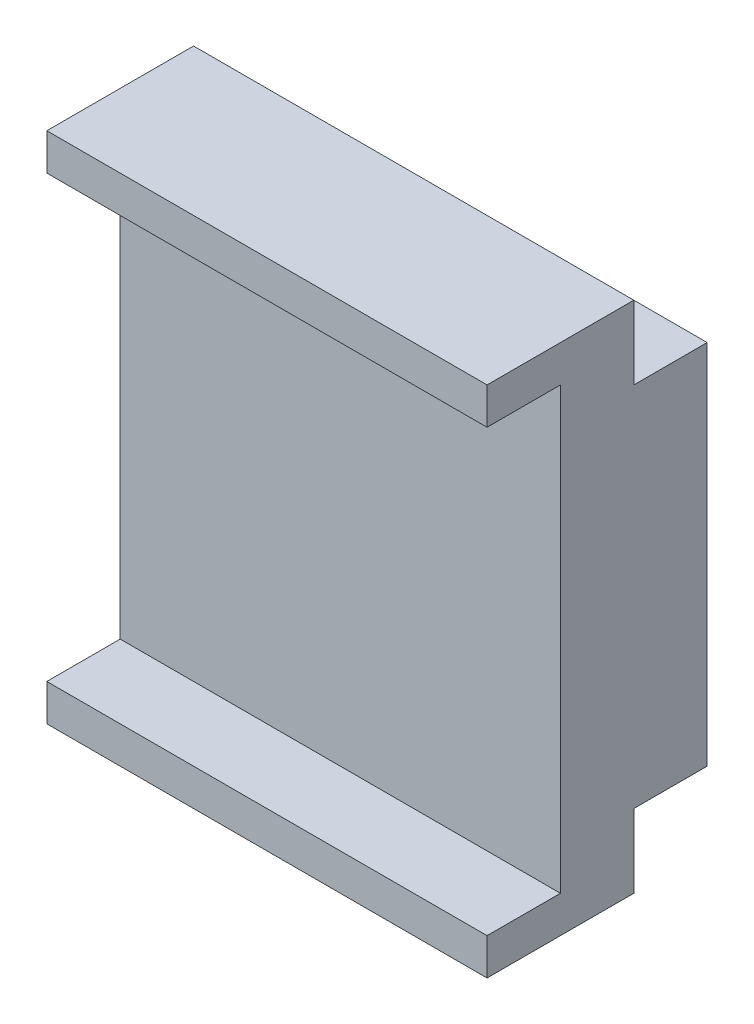
ISO-10303-21;
HEADER;
FILE_DESCRIPTION(('STEP AP214'),'2;1');
FILE_NAME('part.step','',(''),(''),'','','');
FILE_SCHEMA(('AUTOMOTIVE_DESIGN { 1 0 10303 214 1 1 1 1 }'));
ENDSEC;
DATA;
#1=APPLICATION_CONTEXT('core data for automotive mechanical design processes');
#2=APPLICATION_PROTOCOL_DEFINITION('international standard','automotive_design',2000,#1);
#3=PRODUCT_CONTEXT('',#1,'mechanical');
#4=PRODUCT('Part','Part','',(#3));
#5=PRODUCT_RELATED_PRODUCT_CATEGORY('part','',(#4));
#6=PRODUCT_DEFINITION_FORMATION('','',#4);
#7=PRODUCT_DEFINITION_CONTEXT('part definition',#1,'design');
#8=PRODUCT_DEFINITION('design','',#6,#7);
#9=PRODUCT_DEFINITION_SHAPE('','',#8);
#10=(LENGTH_UNIT() NAMED_UNIT(*) SI_UNIT(.MILLI.,.METRE.));
#11=(NAMED_UNIT(*) PLANE_ANGLE_UNIT() SI_UNIT($,.RADIAN.));
#12=(NAMED_UNIT(*) SI_UNIT($,.STERADIAN.) SOLID_ANGLE_UNIT());
#13=UNCERTAINTY_MEASURE_WITH_UNIT(LENGTH_MEASURE(1.E-05),#10,'distance_accuracy_value','');
#14=(GEOMETRIC_REPRESENTATION_CONTEXT(3) GLOBAL_UNCERTAINTY_ASSIGNED_CONTEXT((#13)) GLOBAL_UNIT_ASSIGNED_CONTEXT((#10,
#11,#12)) REPRESENTATION_CONTEXT('',''));
#15=CARTESIAN_POINT('',(0.,0.,0.));
#16=DIRECTION('',(0.,0.,1.));
#17=DIRECTION('',(1.,0.,0.));
#18=AXIS2_PLACEMENT_3D('',#15,#16,#17);
#19=CARTESIAN_POINT('',(30.,5.,0.));
#20=DIRECTION('',(0.,1.,0.));
#21=DIRECTION('',(0.,0.,1.));
#22=AXIS2_PLACEMENT_3D('',#19,#20,#21);
#23=PLANE('',#22);
#24=DIRECTION('',(0.,0.,-1.));
#25=VECTOR('',#24,1.);
#26=CARTESIAN_POINT('',(0.,5.,0.));
#27=LINE('',#26,#25);
#28=CARTESIAN_POINT('',(0.,5.,-5.));
#29=VERTEX_POINT('',#28);
#30=CARTESIAN_POINT('',(0.,5.,-10.));
#31=VERTEX_POINT('',#30);
#32=EDGE_CURVE('E154',#29,#31,#27,.T.);
#33=ORIENTED_EDGE('',*,*,#32,.T.);
#34=DIRECTION('',(-1.,0.,0.));
#35=VECTOR('',#34,1.);
#36=CARTESIAN_POINT('',(30.,5.,-10.));
#37=LINE('',#36,#35);
#38=CARTESIAN_POINT('',(30.,5.,-10.));
#39=VERTEX_POINT('',#38);
#40=EDGE_CURVE('E11',#39,#31,#37,.T.);
#41=ORIENTED_EDGE('',*,*,#40,.F.);
#42=DIRECTION('',(0.,0.,-1.));
#43=VECTOR('',#42,1.);
#44=CARTESIAN_POINT('',(30.,5.,0.));
#45=LINE('',#44,#43);
#46=CARTESIAN_POINT('',(30.,5.,-5.));
#47=VERTEX_POINT('',#46);
#48=EDGE_CURVE('E222',#47,#39,#45,.T.);
#49=ORIENTED_EDGE('',*,*,#48,.F.);
#50=DIRECTION('',(-1.,0.,0.));
#51=VECTOR('',#50,1.);
#52=CARTESIAN_POINT('',(30.,5.,-5.));
#53=LINE('',#52,#51);
#54=EDGE_CURVE('E183',#47,#29,#53,.T.);
#55=ORIENTED_EDGE('',*,*,#54,.T.);
#56=EDGE_LOOP('',(#33,#41,#49,#55));
#57=FACE_BOUND('',#56,.T.);
#58=ADVANCED_FACE('F34',(#57),#23,.F.);
#59=CARTESIAN_POINT('',(30.,0.,-10.));
#60=DIRECTION('',(0.,0.,1.));
#61=DIRECTION('',(1.,0.,0.));
#62=AXIS2_PLACEMENT_3D('',#59,#60,#61);
#63=PLANE('',#62);
#64=DIRECTION('',(0.,1.,0.));
#65=VECTOR('',#64,1.);
#66=CARTESIAN_POINT('',(0.,0.,-10.));
#67=LINE('',#66,#65);
#68=CARTESIAN_POINT('',(0.,30.,-10.));
#69=VERTEX_POINT('',#68);
#70=EDGE_CURVE('E157',#31,#69,#67,.T.);
#71=ORIENTED_EDGE('',*,*,#70,.T.);
#72=DIRECTION('',(-1.,0.,0.));
#73=VECTOR('',#72,1.);
#74=CARTESIAN_POINT('',(30.,30.,-10.));
#75=LINE('',#74,#73);
#76=CARTESIAN_POINT('',(30.,30.,-10.));
#77=VERTEX_POINT('',#76);
#78=EDGE_CURVE('E42',#77,#69,#75,.T.);
#79=ORIENTED_EDGE('',*,*,#78,.F.);
#80=DIRECTION('',(0.,1.,0.));
#81=VECTOR('',#80,1.);
#82=CARTESIAN_POINT('',(30.,0.,-10.));
#83=LINE('',#82,#81);
#84=EDGE_CURVE('E104',#39,#77,#83,.T.);
#85=ORIENTED_EDGE('',*,*,#84,.F.);
#86=ORIENTED_EDGE('',*,*,#40,.T.);
#87=EDGE_LOOP('',(#71,#79,#85,#86));
#88=FACE_BOUND('',#87,.T.);
#89=ADVANCED_FACE('F204',(#88),#63,.F.);
#90=CARTESIAN_POINT('',(30.,30.,0.));
#91=DIRECTION('',(0.,1.,0.));
#92=DIRECTION('',(0.,0.,1.));
#93=AXIS2_PLACEMENT_3D('',#90,#91,#92);
#94=PLANE('',#93);
#95=DIRECTION('',(0.,0.,-1.));
#96=VECTOR('',#95,1.);
#97=CARTESIAN_POINT('',(0.,30.,0.));
#98=LINE('',#97,#96);
#99=CARTESIAN_POINT('',(0.,30.,-5.));
#100=VERTEX_POINT('',#99);
#101=EDGE_CURVE('E160',#100,#69,#98,.T.);
#102=ORIENTED_EDGE('',*,*,#101,.F.);
#103=DIRECTION('',(-1.,0.,0.));
#104=VECTOR('',#103,1.);
#105=CARTESIAN_POINT('',(30.,30.,-5.));
#106=LINE('',#105,#104);
#107=CARTESIAN_POINT('',(30.,30.,-5.));
#108=VERTEX_POINT('',#107);
#109=EDGE_CURVE('E197',#108,#100,#106,.T.);
#110=ORIENTED_EDGE('',*,*,#109,.F.);
#111=DIRECTION('',(0.,0.,-1.));
#112=VECTOR('',#111,1.);
#113=CARTESIAN_POINT('',(30.,30.,0.));
#114=LINE('',#113,#112);
#115=EDGE_CURVE('E203',#108,#77,#114,.T.);
#116=ORIENTED_EDGE('',*,*,#115,.T.);
#117=ORIENTED_EDGE('',*,*,#78,.T.);
#118=EDGE_LOOP('',(#102,#110,#116,#117));
#119=FACE_BOUND('',#118,.T.);
#120=ADVANCED_FACE('F201',(#119),#94,.T.);
#121=CARTESIAN_POINT('',(30.,0.,-5.));
#122=DIRECTION('',(0.,0.,1.));
#123=DIRECTION('',(1.,0.,0.));
#124=AXIS2_PLACEMENT_3D('',#121,#122,#123);
#125=PLANE('',#124);
#126=DIRECTION('',(0.,1.,0.));
#127=VECTOR('',#126,1.);
#128=CARTESIAN_POINT('',(0.,0.,-5.));
#129=LINE('',#128,#127);
#130=CARTESIAN_POINT('',(0.,35.,-5.));
#131=VERTEX_POINT('',#130);
#132=EDGE_CURVE('E163',#100,#131,#129,.T.);
#133=ORIENTED_EDGE('',*,*,#132,.T.);
#134=DIRECTION('',(-1.,0.,0.));
#135=VECTOR('',#134,1.);
#136=CARTESIAN_POINT('',(30.,35.,-5.));
#137=LINE('',#136,#135);
#138=CARTESIAN_POINT('',(30.,35.,-5.));
#139=VERTEX_POINT('',#138);
#140=EDGE_CURVE('E195',#139,#131,#137,.T.);
#141=ORIENTED_EDGE('',*,*,#140,.F.);
#142=DIRECTION('',(0.,1.,0.));
#143=VECTOR('',#142,1.);
#144=CARTESIAN_POINT('',(30.,0.,-5.));
#145=LINE('',#144,#143);
#146=EDGE_CURVE('E217',#108,#139,#145,.T.);
#147=ORIENTED_EDGE('',*,*,#146,.F.);
#148=ORIENTED_EDGE('',*,*,#109,.T.);
#149=EDGE_LOOP('',(#133,#141,#147,#148));
#150=FACE_BOUND('',#149,.T.);
#151=ADVANCED_FACE('F214',(#150),#125,.F.);
#152=CARTESIAN_POINT('',(30.,35.,0.));
#153=DIRECTION('',(0.,1.,0.));
#154=DIRECTION('',(0.,0.,1.));
#155=AXIS2_PLACEMENT_3D('',#152,#153,#154);
#156=PLANE('',#155);
#157=DIRECTION('',(0.,0.,-1.));
#158=VECTOR('',#157,1.);
#159=CARTESIAN_POINT('',(0.,35.,0.));
#160=LINE('',#159,#158);
#161=CARTESIAN_POINT('',(0.,35.,5.));
#162=VERTEX_POINT('',#161);
#163=EDGE_CURVE('E166',#162,#131,#160,.T.);
#164=ORIENTED_EDGE('',*,*,#163,.F.);
#165=DIRECTION('',(-1.,0.,0.));
#166=VECTOR('',#165,1.);
#167=CARTESIAN_POINT('',(30.,35.,5.));
#168=LINE('',#167,#166);
#169=CARTESIAN_POINT('',(30.,35.,5.));
#170=VERTEX_POINT('',#169);
#171=EDGE_CURVE('E193',#170,#162,#168,.T.);
#172=ORIENTED_EDGE('',*,*,#171,.F.);
#173=DIRECTION('',(0.,0.,-1.));
#174=VECTOR('',#173,1.);
#175=CARTESIAN_POINT('',(30.,35.,0.));
#176=LINE('',#175,#174);
#177=EDGE_CURVE('E219',#170,#139,#176,.T.);
#178=ORIENTED_EDGE('',*,*,#177,.T.);
#179=ORIENTED_EDGE('',*,*,#140,.T.);
#180=EDGE_LOOP('',(#164,#172,#178,#179));
#181=FACE_BOUND('',#180,.T.);
#182=ADVANCED_FACE('F269',(#181),#156,.T.);
#183=CARTESIAN_POINT('',(30.,0.,5.00000000000001));
#184=DIRECTION('',(0.,0.,-1.));
#185=DIRECTION('',(0.,1.,0.));
#186=AXIS2_PLACEMENT_3D('',#183,#184,#185);
#187=PLANE('',#186);
#188=DIRECTION('',(0.,-1.,0.));
#189=VECTOR('',#188,1.);
#190=CARTESIAN_POINT('',(0.,0.,5.00000000000001));
#191=LINE('',#190,#189);
#192=CARTESIAN_POINT('',(0.,32.5,5.));
#193=VERTEX_POINT('',#192);
#194=EDGE_CURVE('E169',#162,#193,#191,.T.);
#195=ORIENTED_EDGE('',*,*,#194,.T.);
#196=DIRECTION('',(-1.,0.,0.));
#197=VECTOR('',#196,1.);
#198=CARTESIAN_POINT('',(30.,32.5,5.));
#199=LINE('',#198,#197);
#200=CARTESIAN_POINT('',(30.,32.5,5.));
#201=VERTEX_POINT('',#200);
#202=EDGE_CURVE('E191',#201,#193,#199,.T.);
#203=ORIENTED_EDGE('',*,*,#202,.F.);
#204=DIRECTION('',(0.,-1.,0.));
#205=VECTOR('',#204,1.);
#206=CARTESIAN_POINT('',(30.,0.,5.00000000000001));
#207=LINE('',#206,#205);
#208=EDGE_CURVE('E227',#170,#201,#207,.T.);
#209=ORIENTED_EDGE('',*,*,#208,.F.);
#210=ORIENTED_EDGE('',*,*,#171,.T.);
#211=EDGE_LOOP('',(#195,#203,#209,#210));
#212=FACE_BOUND('',#211,.T.);
#213=ADVANCED_FACE('F274',(#212),#187,.F.);
#214=CARTESIAN_POINT('',(30.,32.5,0.));
#215=DIRECTION('',(0.,-1.,0.));
#216=DIRECTION('',(0.,0.,-1.));
#217=AXIS2_PLACEMENT_3D('',#214,#215,#216);
#218=PLANE('',#217);
#219=DIRECTION('',(0.,0.,1.));
#220=VECTOR('',#219,1.);
#221=CARTESIAN_POINT('',(0.,32.5,0.));
#222=LINE('',#221,#220);
#223=CARTESIAN_POINT('',(0.,32.5,0.));
#224=VERTEX_POINT('',#223);
#225=EDGE_CURVE('E172',#224,#193,#222,.T.);
#226=ORIENTED_EDGE('',*,*,#225,.F.);
#227=DIRECTION('',(-1.,0.,0.));
#228=VECTOR('',#227,1.);
#229=CARTESIAN_POINT('',(30.,32.5,0.));
#230=LINE('',#229,#228);
#231=CARTESIAN_POINT('',(30.,32.5,0.));
#232=VERTEX_POINT('',#231);
#233=EDGE_CURVE('E189',#232,#224,#230,.T.);
#234=ORIENTED_EDGE('',*,*,#233,.F.);
#235=DIRECTION('',(0.,0.,1.));
#236=VECTOR('',#235,1.);
#237=CARTESIAN_POINT('',(30.,32.5,0.));
#238=LINE('',#237,#236);
#239=EDGE_CURVE('E229',#232,#201,#238,.T.);
#240=ORIENTED_EDGE('',*,*,#239,.T.);
#241=ORIENTED_EDGE('',*,*,#202,.T.);
#242=EDGE_LOOP('',(#226,#234,#240,#241));
#243=FACE_BOUND('',#242,.T.);
#244=ADVANCED_FACE('F240',(#243),#218,.T.);
#245=CARTESIAN_POINT('',(30.,0.,0.));
#246=DIRECTION('',(0.,0.,1.));
#247=DIRECTION('',(1.,0.,0.));
#248=AXIS2_PLACEMENT_3D('',#245,#246,#247);
#249=PLANE('',#248);
#250=DIRECTION('',(0.,1.,0.));
#251=VECTOR('',#250,1.);
#252=CARTESIAN_POINT('',(0.,0.,0.));
#253=LINE('',#252,#251);
#254=CARTESIAN_POINT('',(0.,2.5,0.));
#255=VERTEX_POINT('',#254);
#256=EDGE_CURVE('E175',#255,#224,#253,.T.);
#257=ORIENTED_EDGE('',*,*,#256,.F.);
#258=DIRECTION('',(-1.,0.,0.));
#259=VECTOR('',#258,1.);
#260=CARTESIAN_POINT('',(30.,2.5,0.));
#261=LINE('',#260,#259);
#262=CARTESIAN_POINT('',(30.,2.5,0.));
#263=VERTEX_POINT('',#262);
#264=EDGE_CURVE('E187',#263,#255,#261,.T.);
#265=ORIENTED_EDGE('',*,*,#264,.F.);
#266=DIRECTION('',(0.,1.,0.));
#267=VECTOR('',#266,1.);
#268=CARTESIAN_POINT('',(30.,0.,0.));
#269=LINE('',#268,#267);
#270=EDGE_CURVE('E150',#263,#232,#269,.T.);
#271=ORIENTED_EDGE('',*,*,#270,.T.);
#272=ORIENTED_EDGE('',*,*,#233,.T.);
#273=EDGE_LOOP('',(#257,#265,#271,#272));
#274=FACE_BOUND('',#273,.T.);
#275=ADVANCED_FACE('F234',(#274),#249,.T.);
#276=CARTESIAN_POINT('',(30.,2.5,0.));
#277=DIRECTION('',(0.,-1.,0.));
#278=DIRECTION('',(0.,0.,-1.));
#279=AXIS2_PLACEMENT_3D('',#276,#277,#278);
#280=PLANE('',#279);
#281=DIRECTION('',(0.,0.,1.));
#282=VECTOR('',#281,1.);
#283=CARTESIAN_POINT('',(0.,2.5,0.));
#284=LINE('',#283,#282);
#285=CARTESIAN_POINT('',(0.,2.5,5.));
#286=VERTEX_POINT('',#285);
#287=EDGE_CURVE('E178',#255,#286,#284,.T.);
#288=ORIENTED_EDGE('',*,*,#287,.T.);
#289=DIRECTION('',(-1.,0.,0.));
#290=VECTOR('',#289,1.);
#291=CARTESIAN_POINT('',(30.,2.5,5.));
#292=LINE('',#291,#290);
#293=CARTESIAN_POINT('',(30.,2.5,5.));
#294=VERTEX_POINT('',#293);
#295=EDGE_CURVE('E138',#294,#286,#292,.T.);
#296=ORIENTED_EDGE('',*,*,#295,.F.);
#297=DIRECTION('',(0.,0.,1.));
#298=VECTOR('',#297,1.);
#299=CARTESIAN_POINT('',(30.,2.5,0.));
#300=LINE('',#299,#298);
#301=EDGE_CURVE('E147',#263,#294,#300,.T.);
#302=ORIENTED_EDGE('',*,*,#301,.F.);
#303=ORIENTED_EDGE('',*,*,#264,.T.);
#304=EDGE_LOOP('',(#288,#296,#302,#303));
#305=FACE_BOUND('',#304,.T.);
#306=ADVANCED_FACE('F243',(#305),#280,.F.);
#307=CARTESIAN_POINT('',(30.,0.,5.));
#308=DIRECTION('',(0.,0.,1.));
#309=DIRECTION('',(0.,-1.,0.));
#310=AXIS2_PLACEMENT_3D('',#307,#308,#309);
#311=PLANE('',#310);
#312=DIRECTION('',(0.,1.,0.));
#313=VECTOR('',#312,1.);
#314=CARTESIAN_POINT('',(0.,0.,5.));
#315=LINE('',#314,#313);
#316=CARTESIAN_POINT('',(0.,0.,5.));
#317=VERTEX_POINT('',#316);
#318=EDGE_CURVE('E137',#317,#286,#315,.T.);
#319=ORIENTED_EDGE('',*,*,#318,.F.);
#320=DIRECTION('',(-1.,0.,0.));
#321=VECTOR('',#320,1.);
#322=CARTESIAN_POINT('',(30.,0.,5.));
#323=LINE('',#322,#321);
#324=CARTESIAN_POINT('',(30.,0.,5.));
#325=VERTEX_POINT('',#324);
#326=EDGE_CURVE('E131',#325,#317,#323,.T.);
#327=ORIENTED_EDGE('',*,*,#326,.F.);
#328=DIRECTION('',(0.,1.,0.));
#329=VECTOR('',#328,1.);
#330=CARTESIAN_POINT('',(30.,0.,5.));
#331=LINE('',#330,#329);
#332=EDGE_CURVE('E135',#325,#294,#331,.T.);
#333=ORIENTED_EDGE('',*,*,#332,.T.);
#334=ORIENTED_EDGE('',*,*,#295,.T.);
#335=EDGE_LOOP('',(#319,#327,#333,#334));
#336=FACE_BOUND('',#335,.T.);
#337=ADVANCED_FACE('F133',(#336),#311,.T.);
#338=CARTESIAN_POINT('',(30.,0.,0.));
#339=DIRECTION('',(0.,1.,0.));
#340=DIRECTION('',(0.,0.,1.));
#341=AXIS2_PLACEMENT_3D('',#338,#339,#340);
#342=PLANE('',#341);
#343=DIRECTION('',(0.,0.,-1.));
#344=VECTOR('',#343,1.);
#345=CARTESIAN_POINT('',(0.,0.,0.));
#346=LINE('',#345,#344);
#347=CARTESIAN_POINT('',(0.,0.,-5.));
#348=VERTEX_POINT('',#347);
#349=EDGE_CURVE('E90',#317,#348,#346,.T.);
#350=ORIENTED_EDGE('',*,*,#349,.T.);
#351=DIRECTION('',(-1.,0.,0.));
#352=VECTOR('',#351,1.);
#353=CARTESIAN_POINT('',(30.,0.,-5.));
#354=LINE('',#353,#352);
#355=CARTESIAN_POINT('',(30.,0.,-5.));
#356=VERTEX_POINT('',#355);
#357=EDGE_CURVE('E139',#356,#348,#354,.T.);
#358=ORIENTED_EDGE('',*,*,#357,.F.);
#359=DIRECTION('',(0.,0.,-1.));
#360=VECTOR('',#359,1.);
#361=CARTESIAN_POINT('',(30.,0.,0.));
#362=LINE('',#361,#360);
#363=EDGE_CURVE('E141',#325,#356,#362,.T.);
#364=ORIENTED_EDGE('',*,*,#363,.F.);
#365=ORIENTED_EDGE('',*,*,#326,.T.);
#366=EDGE_LOOP('',(#350,#358,#364,#365));
#367=FACE_BOUND('',#366,.T.);
#368=ADVANCED_FACE('F142',(#367),#342,.F.);
#369=EDGE_CURVE('E96',#348,#29,#129,.T.);
#370=ORIENTED_EDGE('',*,*,#369,.T.);
#371=ORIENTED_EDGE('',*,*,#54,.F.);
#372=EDGE_CURVE('E50',#356,#47,#145,.T.);
#373=ORIENTED_EDGE('',*,*,#372,.F.);
#374=ORIENTED_EDGE('',*,*,#357,.T.);
#375=EDGE_LOOP('',(#370,#371,#373,#374));
#376=FACE_BOUND('',#375,.T.);
#377=ADVANCED_FACE('F258',(#376),#125,.F.);
#378=CARTESIAN_POINT('',(30.,0.,0.));
#379=DIRECTION('',(1.,0.,0.));
#380=DIRECTION('',(0.,0.,-1.));
#381=AXIS2_PLACEMENT_3D('',#378,#379,#380);
#382=PLANE('',#381);
#383=ORIENTED_EDGE('',*,*,#48,.T.);
#384=ORIENTED_EDGE('',*,*,#84,.T.);
#385=ORIENTED_EDGE('',*,*,#115,.F.);
#386=ORIENTED_EDGE('',*,*,#146,.T.);
#387=ORIENTED_EDGE('',*,*,#177,.F.);
#388=ORIENTED_EDGE('',*,*,#208,.T.);
#389=ORIENTED_EDGE('',*,*,#239,.F.);
#390=ORIENTED_EDGE('',*,*,#270,.F.);
#391=ORIENTED_EDGE('',*,*,#301,.T.);
#392=ORIENTED_EDGE('',*,*,#332,.F.);
#393=ORIENTED_EDGE('',*,*,#363,.T.);
#394=ORIENTED_EDGE('',*,*,#372,.T.);
#395=EDGE_LOOP('',(#383,#384,#385,#386,#387,#388,#389,#390,#391,#392,#393,#394));
#396=FACE_BOUND('',#395,.T.);
#397=ADVANCED_FACE('F144',(#396),#382,.T.);
#398=CARTESIAN_POINT('',(0.,0.,0.));
#399=DIRECTION('',(1.,0.,0.));
#400=DIRECTION('',(0.,0.,-1.));
#401=AXIS2_PLACEMENT_3D('',#398,#399,#400);
#402=PLANE('',#401);
#403=ORIENTED_EDGE('',*,*,#32,.F.);
#404=ORIENTED_EDGE('',*,*,#369,.F.);
#405=ORIENTED_EDGE('',*,*,#349,.F.);
#406=ORIENTED_EDGE('',*,*,#318,.T.);
#407=ORIENTED_EDGE('',*,*,#287,.F.);
#408=ORIENTED_EDGE('',*,*,#256,.T.);
#409=ORIENTED_EDGE('',*,*,#225,.T.);
#410=ORIENTED_EDGE('',*,*,#194,.F.);
#411=ORIENTED_EDGE('',*,*,#163,.T.);
#412=ORIENTED_EDGE('',*,*,#132,.F.);
#413=ORIENTED_EDGE('',*,*,#101,.T.);
#414=ORIENTED_EDGE('',*,*,#70,.F.);
#415=EDGE_LOOP('',(#403,#404,#405,#406,#407,#408,#409,#410,#411,#412,#413,#414));
#416=FACE_BOUND('',#415,.T.);
#417=ADVANCED_FACE('F209',(#416),#402,.F.);
#418=CLOSED_SHELL('',(#58,#89,#120,#151,#182,#213,#244,#275,#306,#337,#368,#377,#397,#417));
#419=MANIFOLD_SOLID_BREP('B2',#418);
#420=ADVANCED_BREP_SHAPE_REPRESENTATION('',(#18,#419),#14);
#421=SHAPE_DEFINITION_REPRESENTATION(#9,#420);
ENDSEC;
END-ISO-10303-21;
